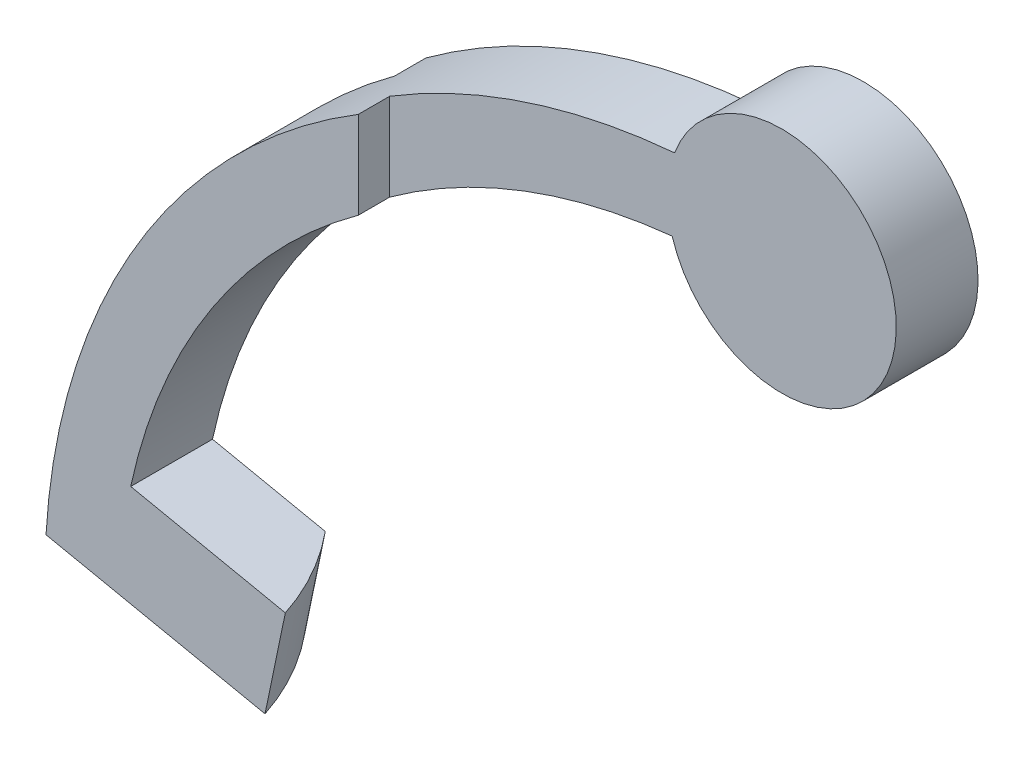
ISO-10303-21;
HEADER;
FILE_DESCRIPTION(('STEP AP214'),'2;1');
FILE_NAME('part.step','',(''),(''),'','','');
FILE_SCHEMA(('AUTOMOTIVE_DESIGN { 1 0 10303 214 1 1 1 1 }'));
ENDSEC;
DATA;
#1=APPLICATION_CONTEXT('core data for automotive mechanical design processes');
#2=APPLICATION_PROTOCOL_DEFINITION('international standard','automotive_design',2000,#1);
#3=PRODUCT_CONTEXT('',#1,'mechanical');
#4=PRODUCT('Part','Part','',(#3));
#5=PRODUCT_RELATED_PRODUCT_CATEGORY('part','',(#4));
#6=PRODUCT_DEFINITION_FORMATION('','',#4);
#7=PRODUCT_DEFINITION_CONTEXT('part definition',#1,'design');
#8=PRODUCT_DEFINITION('design','',#6,#7);
#9=PRODUCT_DEFINITION_SHAPE('','',#8);
#10=(LENGTH_UNIT() NAMED_UNIT(*) SI_UNIT(.MILLI.,.METRE.));
#11=(NAMED_UNIT(*) PLANE_ANGLE_UNIT() SI_UNIT($,.RADIAN.));
#12=(NAMED_UNIT(*) SI_UNIT($,.STERADIAN.) SOLID_ANGLE_UNIT());
#13=UNCERTAINTY_MEASURE_WITH_UNIT(LENGTH_MEASURE(1.E-05),#10,'distance_accuracy_value','');
#14=(GEOMETRIC_REPRESENTATION_CONTEXT(3) GLOBAL_UNCERTAINTY_ASSIGNED_CONTEXT((#13)) GLOBAL_UNIT_ASSIGNED_CONTEXT((#10,
#11,#12)) REPRESENTATION_CONTEXT('',''));
#15=CARTESIAN_POINT('',(0.,0.,0.));
#16=DIRECTION('',(0.,0.,1.));
#17=DIRECTION('',(1.,0.,0.));
#18=AXIS2_PLACEMENT_3D('',#15,#16,#17);
#19=CARTESIAN_POINT('',(0.,0.,0.));
#20=DIRECTION('',(0.,0.,1.));
#21=DIRECTION('',(1.,0.,0.));
#22=AXIS2_PLACEMENT_3D('',#19,#20,#21);
#23=PLANE('',#22);
#24=DIRECTION('',(0.,1.,0.));
#25=VECTOR('',#24,1.);
#26=CARTESIAN_POINT('',(-26.7522213143074,-37.8465318869941,0.));
#27=LINE('',#26,#25);
#28=CARTESIAN_POINT('',(-26.7522213143074,-10.8350760594294,0.));
#29=VERTEX_POINT('',#28);
#30=CARTESIAN_POINT('',(-26.7522213143074,-5.12154782560139,0.));
#31=VERTEX_POINT('',#30);
#32=EDGE_CURVE('E173',#29,#31,#27,.T.);
#33=ORIENTED_EDGE('',*,*,#32,.T.);
#34=CARTESIAN_POINT('',(-3.12824808202929,-37.4001458236651,0.));
#35=DIRECTION('',(0.,0.,1.));
#36=DIRECTION('',(1.,0.,0.));
#37=AXIS2_PLACEMENT_3D('',#34,#35,#36);
#38=CIRCLE('',#37,40.);
#39=CARTESIAN_POINT('',(-6.55624058274921,2.45269431872632,0.));
#40=VERTEX_POINT('',#39);
#41=EDGE_CURVE('E151',#40,#31,#38,.T.);
#42=ORIENTED_EDGE('',*,*,#41,.F.);
#43=CARTESIAN_POINT('',(0.,0.,0.));
#44=DIRECTION('',(0.,0.,1.));
#45=DIRECTION('',(1.,0.,0.));
#46=AXIS2_PLACEMENT_3D('',#43,#44,#45);
#47=CIRCLE('',#46,7.);
#48=CARTESIAN_POINT('',(-6.69917083103431,-2.0300517669801,0.));
#49=VERTEX_POINT('',#48);
#50=EDGE_CURVE('E57',#49,#40,#47,.T.);
#51=ORIENTED_EDGE('',*,*,#50,.F.);
#52=CARTESIAN_POINT('',(-3.12824808202929,-37.4001458236651,0.));
#53=DIRECTION('',(0.,0.,1.));
#54=DIRECTION('',(1.,0.,0.));
#55=AXIS2_PLACEMENT_3D('',#52,#53,#54);
#56=CIRCLE('',#55,35.5498951173995);
#57=EDGE_CURVE('E149',#29,#49,#56,.F.);
#58=ORIENTED_EDGE('',*,*,#57,.F.);
#59=EDGE_LOOP('',(#33,#42,#51,#58));
#60=FACE_BOUND('',#59,.T.);
#61=ADVANCED_FACE('F35',(#60),#23,.F.);
#62=CARTESIAN_POINT('',(-7.54083786418247,-36.2290461115529,45.));
#63=DIRECTION('',(-0.203776064234001,-0.979017525708963,0.));
#64=DIRECTION('',(0.979017525708963,-0.203776064234001,0.));
#65=AXIS2_PLACEMENT_3D('',#62,#63,#64);
#66=PLANE('',#65);
#67=DIRECTION('',(0.979017525708963,-0.203776064234001,0.));
#68=VECTOR('',#67,1.);
#69=CARTESIAN_POINT('',(-7.54083786418247,-36.2290461115529,6.91848498584946));
#70=LINE('',#69,#68);
#71=CARTESIAN_POINT('',(-37.8809726052462,-29.9139464493828,6.91848498584946));
#72=VERTEX_POINT('',#71);
#73=CARTESIAN_POINT('',(-28.4288232400276,-31.8813492237114,6.91848498584946));
#74=VERTEX_POINT('',#73);
#75=EDGE_CURVE('E124',#72,#74,#70,.T.);
#76=ORIENTED_EDGE('',*,*,#75,.T.);
#77=CARTESIAN_POINT('',(-41.6837461565048,-29.1224241251144,10.811396575353));
#78=DIRECTION('',(-0.203776064234001,-0.979017525708963,0.));
#79=DIRECTION('',(-0.979017525708963,0.203776064234001,0.));
#80=AXIS2_PLACEMENT_3D('',#77,#78,#79);
#81=CIRCLE('',#80,14.0875622399729);
#82=CARTESIAN_POINT('',(-30.9870877070014,-31.348863286882,1.91848498584946));
#83=VERTEX_POINT('',#82);
#84=EDGE_CURVE('E111',#83,#74,#81,.T.);
#85=ORIENTED_EDGE('',*,*,#84,.F.);
#86=DIRECTION('',(0.979017525708963,-0.203776064234001,0.));
#87=VECTOR('',#86,1.);
#88=CARTESIAN_POINT('',(-7.54083786418248,-36.2290461115529,1.91848498584946));
#89=LINE('',#88,#87);
#90=CARTESIAN_POINT('',(-37.8809726052462,-29.9139464493828,1.91848498584946));
#91=VERTEX_POINT('',#90);
#92=EDGE_CURVE('E198',#91,#83,#89,.T.);
#93=ORIENTED_EDGE('',*,*,#92,.F.);
#94=DIRECTION('',(0.,0.,-1.));
#95=VECTOR('',#94,1.);
#96=CARTESIAN_POINT('',(-37.8809726052462,-29.9139464493828,45.));
#97=LINE('',#96,#95);
#98=EDGE_CURVE('E134',#72,#91,#97,.T.);
#99=ORIENTED_EDGE('',*,*,#98,.F.);
#100=EDGE_LOOP('',(#76,#85,#93,#99));
#101=FACE_BOUND('',#100,.T.);
#102=ADVANCED_FACE('F132',(#101),#66,.F.);
#103=CARTESIAN_POINT('',(-3.12824808202929,-37.4001458236651,45.));
#104=DIRECTION('',(0.,0.,-1.));
#105=DIRECTION('',(-1.,0.,0.));
#106=AXIS2_PLACEMENT_3D('',#103,#104,#105);
#107=CYLINDRICAL_SURFACE('',#106,35.5498951173995);
#108=CARTESIAN_POINT('',(-3.12824808202929,-37.4001458236651,1.91848498584946));
#109=DIRECTION('',(0.,0.,-1.));
#110=DIRECTION('',(-1.,0.,0.));
#111=AXIS2_PLACEMENT_3D('',#108,#109,#110);
#112=CIRCLE('',#111,35.5498951173995);
#113=CARTESIAN_POINT('',(-26.7522213143074,-10.8350760594294,1.91848498584946));
#114=VERTEX_POINT('',#113);
#115=EDGE_CURVE('E192',#114,#91,#112,.F.);
#116=ORIENTED_EDGE('',*,*,#115,.F.);
#117=DIRECTION('',(0.,0.,-1.));
#118=VECTOR('',#117,1.);
#119=CARTESIAN_POINT('',(-26.7522213143074,-10.8350760594294,45.));
#120=LINE('',#119,#118);
#121=EDGE_CURVE('E191',#29,#114,#120,.F.);
#122=ORIENTED_EDGE('',*,*,#121,.F.);
#123=ORIENTED_EDGE('',*,*,#57,.T.);
#124=DIRECTION('',(0.,0.,-1.));
#125=VECTOR('',#124,1.);
#126=CARTESIAN_POINT('',(-6.69917083103431,-2.0300517669801,45.));
#127=LINE('',#126,#125);
#128=CARTESIAN_POINT('',(-6.69917083103431,-2.0300517669801,5.));
#129=VERTEX_POINT('',#128);
#130=EDGE_CURVE('E159',#129,#49,#127,.T.);
#131=ORIENTED_EDGE('',*,*,#130,.F.);
#132=CARTESIAN_POINT('',(-3.12824808202929,-37.4001458236651,5.));
#133=DIRECTION('',(0.,0.,-1.));
#134=DIRECTION('',(-1.,0.,0.));
#135=AXIS2_PLACEMENT_3D('',#132,#133,#134);
#136=CIRCLE('',#135,35.5498951173995);
#137=CARTESIAN_POINT('',(-23.9674272170114,-8.59869350198118,5.00000000000001));
#138=VERTEX_POINT('',#137);
#139=EDGE_CURVE('E146',#129,#138,#136,.F.);
#140=ORIENTED_EDGE('',*,*,#139,.T.);
#141=DIRECTION('',(0.,0.,-1.));
#142=VECTOR('',#141,1.);
#143=CARTESIAN_POINT('',(-23.9674272170114,-8.59869350198118,45.));
#144=LINE('',#143,#142);
#145=CARTESIAN_POINT('',(-23.9674272170114,-8.59869350198117,6.91848498584946));
#146=VERTEX_POINT('',#145);
#147=EDGE_CURVE('E138',#138,#146,#144,.F.);
#148=ORIENTED_EDGE('',*,*,#147,.T.);
#149=CARTESIAN_POINT('',(-3.12824808202929,-37.4001458236651,6.91848498584946));
#150=DIRECTION('',(0.,0.,-1.));
#151=DIRECTION('',(-1.,0.,0.));
#152=AXIS2_PLACEMENT_3D('',#149,#150,#151);
#153=CIRCLE('',#152,35.5498951173995);
#154=EDGE_CURVE('E135',#146,#72,#153,.F.);
#155=ORIENTED_EDGE('',*,*,#154,.T.);
#156=ORIENTED_EDGE('',*,*,#98,.T.);
#157=EDGE_LOOP('',(#116,#122,#123,#131,#140,#148,#155,#156));
#158=FACE_BOUND('',#157,.T.);
#159=ADVANCED_FACE('F190',(#158),#107,.F.);
#160=CARTESIAN_POINT('',(-3.12824808202929,-37.4001458236651,45.));
#161=DIRECTION('',(0.,0.,-1.));
#162=DIRECTION('',(-1.,0.,0.));
#163=AXIS2_PLACEMENT_3D('',#160,#161,#162);
#164=CYLINDRICAL_SURFACE('',#163,40.);
#165=CARTESIAN_POINT('',(-3.12824808202929,-37.4001458236651,1.91848498584946));
#166=DIRECTION('',(0.,0.,-1.));
#167=DIRECTION('',(-1.,0.,0.));
#168=AXIS2_PLACEMENT_3D('',#165,#166,#167);
#169=CIRCLE('',#168,40.);
#170=CARTESIAN_POINT('',(-43.0597148745306,-35.0596416473472,1.91848498584946));
#171=VERTEX_POINT('',#170);
#172=CARTESIAN_POINT('',(-26.7522213143074,-5.12154782560139,1.91848498584946));
#173=VERTEX_POINT('',#172);
#174=EDGE_CURVE('E207',#171,#173,#169,.T.);
#175=ORIENTED_EDGE('',*,*,#174,.F.);
#176=DIRECTION('',(0.,0.,-1.));
#177=VECTOR('',#176,1.);
#178=CARTESIAN_POINT('',(-43.0597148745306,-35.0596416473472,45.));
#179=LINE('',#178,#177);
#180=CARTESIAN_POINT('',(-43.0597148745306,-35.0596416473472,6.91848498584946));
#181=VERTEX_POINT('',#180);
#182=EDGE_CURVE('E154',#181,#171,#179,.T.);
#183=ORIENTED_EDGE('',*,*,#182,.F.);
#184=CARTESIAN_POINT('',(-3.12824808202929,-37.4001458236651,6.91848498584946));
#185=DIRECTION('',(0.,0.,-1.));
#186=DIRECTION('',(-1.,0.,0.));
#187=AXIS2_PLACEMENT_3D('',#184,#185,#186);
#188=CIRCLE('',#187,40.);
#189=CARTESIAN_POINT('',(-23.9674272170114,-3.25737773172323,6.91848498584946));
#190=VERTEX_POINT('',#189);
#191=EDGE_CURVE('E136',#181,#190,#188,.T.);
#192=ORIENTED_EDGE('',*,*,#191,.T.);
#193=DIRECTION('',(0.,0.,-1.));
#194=VECTOR('',#193,1.);
#195=CARTESIAN_POINT('',(-23.9674272170114,-3.25737773172324,45.));
#196=LINE('',#195,#194);
#197=CARTESIAN_POINT('',(-23.9674272170114,-3.25737773172324,5.00000000000001));
#198=VERTEX_POINT('',#197);
#199=EDGE_CURVE('E128',#190,#198,#196,.T.);
#200=ORIENTED_EDGE('',*,*,#199,.T.);
#201=CARTESIAN_POINT('',(-3.12824808202929,-37.4001458236651,5.));
#202=DIRECTION('',(0.,0.,-1.));
#203=DIRECTION('',(-1.,0.,0.));
#204=AXIS2_PLACEMENT_3D('',#201,#202,#203);
#205=CIRCLE('',#204,40.);
#206=CARTESIAN_POINT('',(-6.55624058274921,2.45269431872631,5.));
#207=VERTEX_POINT('',#206);
#208=EDGE_CURVE('E166',#198,#207,#205,.T.);
#209=ORIENTED_EDGE('',*,*,#208,.T.);
#210=DIRECTION('',(0.,0.,-1.));
#211=VECTOR('',#210,1.);
#212=CARTESIAN_POINT('',(-6.55624058274921,2.45269431872632,45.));
#213=LINE('',#212,#211);
#214=EDGE_CURVE('E157',#207,#40,#213,.T.);
#215=ORIENTED_EDGE('',*,*,#214,.T.);
#216=ORIENTED_EDGE('',*,*,#41,.T.);
#217=DIRECTION('',(0.,0.,-1.));
#218=VECTOR('',#217,1.);
#219=CARTESIAN_POINT('',(-26.7522213143074,-5.12154782560139,45.));
#220=LINE('',#219,#218);
#221=EDGE_CURVE('E43',#173,#31,#220,.T.);
#222=ORIENTED_EDGE('',*,*,#221,.F.);
#223=EDGE_LOOP('',(#175,#183,#192,#200,#209,#215,#216,#222));
#224=FACE_BOUND('',#223,.T.);
#225=ADVANCED_FACE('F184',(#224),#164,.T.);
#226=CARTESIAN_POINT('',(-8.78245143456309,-42.1942287748356,45.));
#227=DIRECTION('',(0.203776064234002,0.979017525708963,0.));
#228=DIRECTION('',(-0.979017525708963,0.203776064234002,0.));
#229=AXIS2_PLACEMENT_3D('',#226,#227,#228);
#230=PLANE('',#229);
#231=DIRECTION('',(-0.979017525708963,0.203776064234002,0.));
#232=VECTOR('',#231,1.);
#233=CARTESIAN_POINT('',(-8.78245143456309,-42.1942287748356,1.91848498584946));
#234=LINE('',#233,#232);
#235=CARTESIAN_POINT('',(-32.2287012773819,-37.3140459501646,1.91848498584946));
#236=VERTEX_POINT('',#235);
#237=EDGE_CURVE('E182',#236,#171,#234,.T.);
#238=ORIENTED_EDGE('',*,*,#237,.F.);
#239=CARTESIAN_POINT('',(-42.9253597268854,-35.0876067883971,10.811396575353));
#240=DIRECTION('',(0.203776064234002,0.979017525708963,0.));
#241=DIRECTION('',(-0.979017525708963,0.203776064234002,0.));
#242=AXIS2_PLACEMENT_3D('',#239,#240,#241);
#243=CIRCLE('',#242,14.0875622399729);
#244=CARTESIAN_POINT('',(-29.6704368104082,-37.8465318869941,6.91848498584946));
#245=VERTEX_POINT('',#244);
#246=EDGE_CURVE('E49',#236,#245,#243,.F.);
#247=ORIENTED_EDGE('',*,*,#246,.T.);
#248=DIRECTION('',(-0.979017525708963,0.203776064234002,0.));
#249=VECTOR('',#248,1.);
#250=CARTESIAN_POINT('',(-8.78245143456309,-42.1942287748356,6.91848498584946));
#251=LINE('',#250,#249);
#252=EDGE_CURVE('E127',#245,#181,#251,.T.);
#253=ORIENTED_EDGE('',*,*,#252,.T.);
#254=ORIENTED_EDGE('',*,*,#182,.T.);
#255=EDGE_LOOP('',(#238,#247,#253,#254));
#256=FACE_BOUND('',#255,.T.);
#257=ADVANCED_FACE('F206',(#256),#230,.F.);
#258=CARTESIAN_POINT('',(0.,0.,5.));
#259=DIRECTION('',(0.,0.,-1.));
#260=DIRECTION('',(-1.,0.,0.));
#261=AXIS2_PLACEMENT_3D('',#258,#259,#260);
#262=CYLINDRICAL_SURFACE('',#261,7.);
#263=ORIENTED_EDGE('',*,*,#130,.T.);
#264=ORIENTED_EDGE('',*,*,#50,.T.);
#265=ORIENTED_EDGE('',*,*,#214,.F.);
#266=CARTESIAN_POINT('',(0.,0.,5.));
#267=DIRECTION('',(0.,0.,1.));
#268=DIRECTION('',(1.,0.,0.));
#269=AXIS2_PLACEMENT_3D('',#266,#267,#268);
#270=CIRCLE('',#269,7.);
#271=EDGE_CURVE('E129',#129,#207,#270,.T.);
#272=ORIENTED_EDGE('',*,*,#271,.F.);
#273=EDGE_LOOP('',(#263,#264,#265,#272));
#274=FACE_BOUND('',#273,.T.);
#275=ADVANCED_FACE('F37',(#274),#262,.T.);
#276=CARTESIAN_POINT('',(0.,0.,5.));
#277=DIRECTION('',(0.,0.,1.));
#278=DIRECTION('',(1.,0.,0.));
#279=AXIS2_PLACEMENT_3D('',#276,#277,#278);
#280=PLANE('',#279);
#281=ORIENTED_EDGE('',*,*,#271,.T.);
#282=ORIENTED_EDGE('',*,*,#208,.F.);
#283=DIRECTION('',(0.,-1.,0.));
#284=VECTOR('',#283,1.);
#285=CARTESIAN_POINT('',(-23.9674272170114,5.,5.00000000000001));
#286=LINE('',#285,#284);
#287=EDGE_CURVE('E196',#198,#138,#286,.T.);
#288=ORIENTED_EDGE('',*,*,#287,.T.);
#289=ORIENTED_EDGE('',*,*,#139,.F.);
#290=EDGE_LOOP('',(#281,#282,#288,#289));
#291=FACE_BOUND('',#290,.T.);
#292=ADVANCED_FACE('F217',(#291),#280,.T.);
#293=CARTESIAN_POINT('',(-23.9674272170114,5.,0.));
#294=DIRECTION('',(-1.,0.,0.));
#295=DIRECTION('',(0.,0.,1.));
#296=AXIS2_PLACEMENT_3D('',#293,#294,#295);
#297=PLANE('',#296);
#298=ORIENTED_EDGE('',*,*,#287,.F.);
#299=ORIENTED_EDGE('',*,*,#199,.F.);
#300=DIRECTION('',(0.,-1.,0.));
#301=VECTOR('',#300,1.);
#302=CARTESIAN_POINT('',(-23.9674272170114,5.,6.91848498584946));
#303=LINE('',#302,#301);
#304=EDGE_CURVE('E193',#190,#146,#303,.T.);
#305=ORIENTED_EDGE('',*,*,#304,.T.);
#306=ORIENTED_EDGE('',*,*,#147,.F.);
#307=EDGE_LOOP('',(#298,#299,#305,#306));
#308=FACE_BOUND('',#307,.T.);
#309=ADVANCED_FACE('F216',(#308),#297,.F.);
#310=CARTESIAN_POINT('',(0.,5.,6.91848498584946));
#311=DIRECTION('',(0.,0.,-1.));
#312=DIRECTION('',(-1.,0.,0.));
#313=AXIS2_PLACEMENT_3D('',#310,#311,#312);
#314=PLANE('',#313);
#315=ORIENTED_EDGE('',*,*,#304,.F.);
#316=ORIENTED_EDGE('',*,*,#191,.F.);
#317=ORIENTED_EDGE('',*,*,#252,.F.);
#318=DIRECTION('',(-0.203776064234001,-0.979017525708963,0.));
#319=VECTOR('',#318,1.);
#320=CARTESIAN_POINT('',(-20.8879853758451,4.34769688784146,6.91848498584946));
#321=LINE('',#320,#319);
#322=EDGE_CURVE('E114',#74,#245,#321,.T.);
#323=ORIENTED_EDGE('',*,*,#322,.F.);
#324=ORIENTED_EDGE('',*,*,#75,.F.);
#325=ORIENTED_EDGE('',*,*,#154,.F.);
#326=EDGE_LOOP('',(#315,#316,#317,#323,#324,#325));
#327=FACE_BOUND('',#326,.T.);
#328=ADVANCED_FACE('F123',(#327),#314,.F.);
#329=CARTESIAN_POINT('',(-26.7522213143074,-37.8465318869941,0.));
#330=DIRECTION('',(-1.,0.,0.));
#331=DIRECTION('',(0.,0.,1.));
#332=AXIS2_PLACEMENT_3D('',#329,#330,#331);
#333=PLANE('',#332);
#334=ORIENTED_EDGE('',*,*,#121,.T.);
#335=DIRECTION('',(0.,1.,0.));
#336=VECTOR('',#335,1.);
#337=CARTESIAN_POINT('',(-26.7522213143074,-37.8465318869941,1.91848498584946));
#338=LINE('',#337,#336);
#339=EDGE_CURVE('E176',#114,#173,#338,.T.);
#340=ORIENTED_EDGE('',*,*,#339,.T.);
#341=ORIENTED_EDGE('',*,*,#221,.T.);
#342=ORIENTED_EDGE('',*,*,#32,.F.);
#343=EDGE_LOOP('',(#334,#340,#341,#342));
#344=FACE_BOUND('',#343,.T.);
#345=ADVANCED_FACE('F172',(#344),#333,.T.);
#346=CARTESIAN_POINT('',(0.,-37.8465318869941,1.91848498584946));
#347=DIRECTION('',(0.,0.,-1.));
#348=DIRECTION('',(-1.,0.,0.));
#349=AXIS2_PLACEMENT_3D('',#346,#347,#348);
#350=PLANE('',#349);
#351=DIRECTION('',(0.203776064234001,0.979017525708963,0.));
#352=VECTOR('',#351,1.);
#353=CARTESIAN_POINT('',(-32.7846868227319,-39.9852114522789,1.91848498584946));
#354=LINE('',#353,#352);
#355=EDGE_CURVE('E11',#236,#83,#354,.T.);
#356=ORIENTED_EDGE('',*,*,#355,.F.);
#357=ORIENTED_EDGE('',*,*,#237,.T.);
#358=ORIENTED_EDGE('',*,*,#174,.T.);
#359=ORIENTED_EDGE('',*,*,#339,.F.);
#360=ORIENTED_EDGE('',*,*,#115,.T.);
#361=ORIENTED_EDGE('',*,*,#92,.T.);
#362=EDGE_LOOP('',(#356,#357,#358,#359,#360,#361));
#363=FACE_BOUND('',#362,.T.);
#364=ADVANCED_FACE('F213',(#363),#350,.T.);
#365=CARTESIAN_POINT('',(-43.4813452722354,-37.7587722905114,10.811396575353));
#366=DIRECTION('',(0.203776064234001,0.979017525708963,0.));
#367=DIRECTION('',(-0.979017525708963,0.203776064234001,0.));
#368=AXIS2_PLACEMENT_3D('',#365,#366,#367);
#369=CYLINDRICAL_SURFACE('',#368,14.0875622399729);
#370=ORIENTED_EDGE('',*,*,#355,.T.);
#371=ORIENTED_EDGE('',*,*,#84,.T.);
#372=ORIENTED_EDGE('',*,*,#322,.T.);
#373=ORIENTED_EDGE('',*,*,#246,.F.);
#374=EDGE_LOOP('',(#370,#371,#372,#373));
#375=FACE_BOUND('',#374,.T.);
#376=ADVANCED_FACE('F113',(#375),#369,.T.);
#377=CLOSED_SHELL('',(#61,#102,#159,#225,#257,#275,#292,#309,#328,#345,#364,#376));
#378=MANIFOLD_SOLID_BREP('B2',#377);
#379=ADVANCED_BREP_SHAPE_REPRESENTATION('',(#18,#378),#14);
#380=SHAPE_DEFINITION_REPRESENTATION(#9,#379);
ENDSEC;
END-ISO-10303-21;
